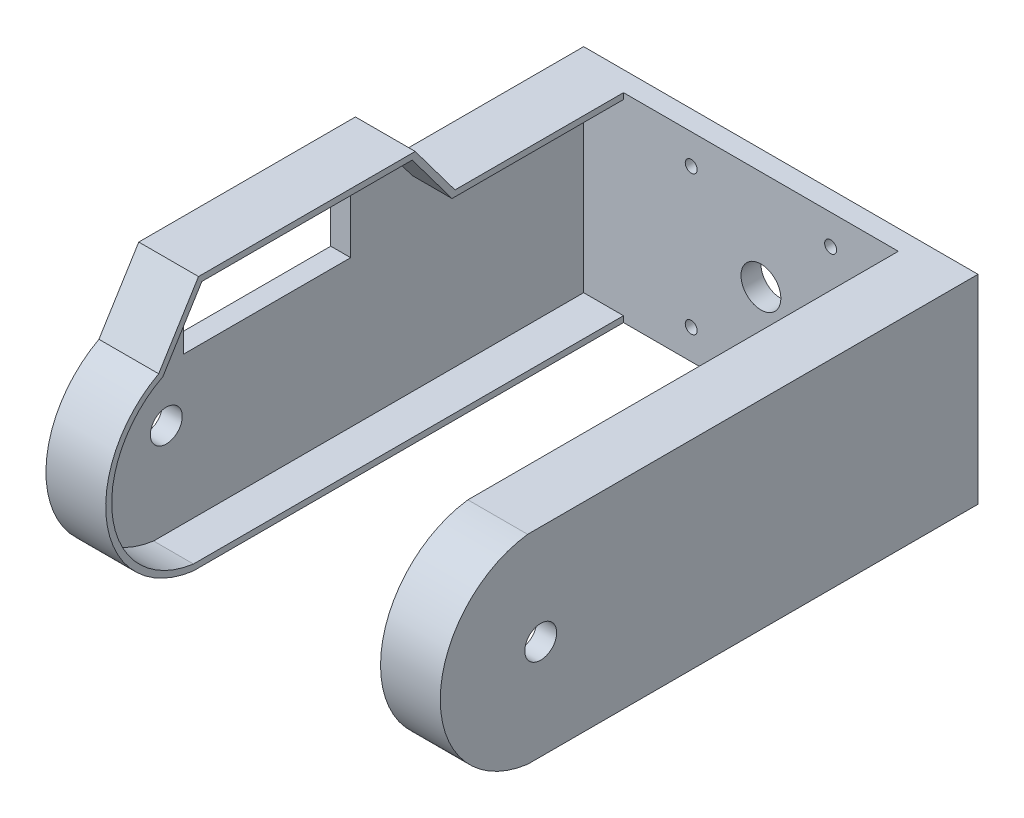
ISO-10303-21;
HEADER;
FILE_DESCRIPTION(('STEP AP214'),'2;1');
FILE_NAME('part.step','',(''),(''),'','','');
FILE_SCHEMA(('AUTOMOTIVE_DESIGN { 1 0 10303 214 1 1 1 1 }'));
ENDSEC;
DATA;
#1=APPLICATION_CONTEXT('core data for automotive mechanical design processes');
#2=APPLICATION_PROTOCOL_DEFINITION('international standard','automotive_design',2000,#1);
#3=PRODUCT_CONTEXT('',#1,'mechanical');
#4=PRODUCT('Part','Part','',(#3));
#5=PRODUCT_RELATED_PRODUCT_CATEGORY('part','',(#4));
#6=PRODUCT_DEFINITION_FORMATION('','',#4);
#7=PRODUCT_DEFINITION_CONTEXT('part definition',#1,'design');
#8=PRODUCT_DEFINITION('design','',#6,#7);
#9=PRODUCT_DEFINITION_SHAPE('','',#8);
#10=(LENGTH_UNIT() NAMED_UNIT(*) SI_UNIT(.MILLI.,.METRE.));
#11=(NAMED_UNIT(*) PLANE_ANGLE_UNIT() SI_UNIT($,.RADIAN.));
#12=(NAMED_UNIT(*) SI_UNIT($,.STERADIAN.) SOLID_ANGLE_UNIT());
#13=UNCERTAINTY_MEASURE_WITH_UNIT(LENGTH_MEASURE(1.E-05),#10,'distance_accuracy_value','');
#14=(GEOMETRIC_REPRESENTATION_CONTEXT(3) GLOBAL_UNCERTAINTY_ASSIGNED_CONTEXT((#13)) GLOBAL_UNIT_ASSIGNED_CONTEXT((#10,
#11,#12)) REPRESENTATION_CONTEXT('',''));
#15=CARTESIAN_POINT('',(0.,0.,0.));
#16=DIRECTION('',(0.,0.,1.));
#17=DIRECTION('',(1.,0.,0.));
#18=AXIS2_PLACEMENT_3D('',#15,#16,#17);
#19=CARTESIAN_POINT('',(0.,0.,5.));
#20=DIRECTION('',(0.,0.,1.));
#21=DIRECTION('',(1.,0.,0.));
#22=AXIS2_PLACEMENT_3D('',#19,#20,#21);
#23=PLANE('',#22);
#24=CARTESIAN_POINT('',(17.5,17.5,5.));
#25=DIRECTION('',(0.,0.,1.));
#26=DIRECTION('',(1.,0.,0.));
#27=AXIS2_PLACEMENT_3D('',#24,#25,#26);
#28=CIRCLE('',#27,1.5);
#29=CARTESIAN_POINT('',(19.,17.5,5.));
#30=VERTEX_POINT('',#29);
#31=EDGE_CURVE('E877',#30,#30,#28,.T.);
#32=ORIENTED_EDGE('',*,*,#31,.F.);
#33=EDGE_LOOP('',(#32));
#34=FACE_BOUND('',#33,.T.);
#35=CARTESIAN_POINT('',(17.5,-17.5,5.));
#36=DIRECTION('',(0.,0.,1.));
#37=DIRECTION('',(1.,0.,0.));
#38=AXIS2_PLACEMENT_3D('',#35,#36,#37);
#39=CIRCLE('',#38,1.5);
#40=CARTESIAN_POINT('',(19.,-17.5,5.));
#41=VERTEX_POINT('',#40);
#42=EDGE_CURVE('E897',#41,#41,#39,.T.);
#43=ORIENTED_EDGE('',*,*,#42,.F.);
#44=EDGE_LOOP('',(#43));
#45=FACE_BOUND('',#44,.T.);
#46=CARTESIAN_POINT('',(-17.5,-17.5,5.));
#47=DIRECTION('',(0.,0.,1.));
#48=DIRECTION('',(1.,0.,0.));
#49=AXIS2_PLACEMENT_3D('',#46,#47,#48);
#50=CIRCLE('',#49,1.5);
#51=CARTESIAN_POINT('',(-16.,-17.5,5.));
#52=VERTEX_POINT('',#51);
#53=EDGE_CURVE('E894',#52,#52,#50,.T.);
#54=ORIENTED_EDGE('',*,*,#53,.F.);
#55=EDGE_LOOP('',(#54));
#56=FACE_BOUND('',#55,.T.);
#57=CARTESIAN_POINT('',(-17.5,17.5,5.));
#58=DIRECTION('',(0.,0.,1.));
#59=DIRECTION('',(1.,0.,0.));
#60=AXIS2_PLACEMENT_3D('',#57,#58,#59);
#61=CIRCLE('',#60,1.5);
#62=CARTESIAN_POINT('',(-16.,17.5,5.));
#63=VERTEX_POINT('',#62);
#64=EDGE_CURVE('E891',#63,#63,#61,.T.);
#65=ORIENTED_EDGE('',*,*,#64,.F.);
#66=EDGE_LOOP('',(#65));
#67=FACE_BOUND('',#66,.T.);
#68=CARTESIAN_POINT('',(0.,0.,5.));
#69=DIRECTION('',(0.,0.,1.));
#70=DIRECTION('',(1.,0.,0.));
#71=AXIS2_PLACEMENT_3D('',#68,#69,#70);
#72=CIRCLE('',#71,5.);
#73=CARTESIAN_POINT('',(5.,0.,5.));
#74=VERTEX_POINT('',#73);
#75=EDGE_CURVE('E308',#74,#74,#72,.F.);
#76=ORIENTED_EDGE('',*,*,#75,.T.);
#77=EDGE_LOOP('',(#76));
#78=FACE_BOUND('',#77,.T.);
#79=DIRECTION('',(1.,0.,0.));
#80=VECTOR('',#79,1.);
#81=CARTESIAN_POINT('',(0.,-23.5,5.));
#82=LINE('',#81,#80);
#83=CARTESIAN_POINT('',(-44.5,-23.5,5.));
#84=VERTEX_POINT('',#83);
#85=CARTESIAN_POINT('',(-34.5,-23.5,5.));
#86=VERTEX_POINT('',#85);
#87=EDGE_CURVE('E121',#84,#86,#82,.T.);
#88=ORIENTED_EDGE('',*,*,#87,.T.);
#89=DIRECTION('',(0.,-1.,0.));
#90=VECTOR('',#89,1.);
#91=CARTESIAN_POINT('',(-34.5,0.,5.));
#92=LINE('',#91,#90);
#93=CARTESIAN_POINT('',(-34.5,-25.,5.));
#94=VERTEX_POINT('',#93);
#95=EDGE_CURVE('E345',#86,#94,#92,.T.);
#96=ORIENTED_EDGE('',*,*,#95,.T.);
#97=DIRECTION('',(1.,0.,0.));
#98=VECTOR('',#97,1.);
#99=CARTESIAN_POINT('',(-49.5,-25.,5.));
#100=LINE('',#99,#98);
#101=CARTESIAN_POINT('',(34.5,-25.,5.));
#102=VERTEX_POINT('',#101);
#103=EDGE_CURVE('E456',#94,#102,#100,.T.);
#104=ORIENTED_EDGE('',*,*,#103,.T.);
#105=DIRECTION('',(0.,1.,0.));
#106=VECTOR('',#105,1.);
#107=CARTESIAN_POINT('',(34.5,0.,5.));
#108=LINE('',#107,#106);
#109=CARTESIAN_POINT('',(34.5,-23.5,5.));
#110=VERTEX_POINT('',#109);
#111=EDGE_CURVE('E425',#102,#110,#108,.T.);
#112=ORIENTED_EDGE('',*,*,#111,.T.);
#113=DIRECTION('',(1.,0.,0.));
#114=VECTOR('',#113,1.);
#115=CARTESIAN_POINT('',(0.,-23.5,5.));
#116=LINE('',#115,#114);
#117=CARTESIAN_POINT('',(44.5,-23.5,5.));
#118=VERTEX_POINT('',#117);
#119=EDGE_CURVE('E479',#110,#118,#116,.T.);
#120=ORIENTED_EDGE('',*,*,#119,.T.);
#121=DIRECTION('',(0.,-1.,0.));
#122=VECTOR('',#121,1.);
#123=CARTESIAN_POINT('',(44.5,25.,5.));
#124=LINE('',#123,#122);
#125=CARTESIAN_POINT('',(44.5,23.5,5.));
#126=VERTEX_POINT('',#125);
#127=EDGE_CURVE('E452',#126,#118,#124,.T.);
#128=ORIENTED_EDGE('',*,*,#127,.F.);
#129=DIRECTION('',(-1.,0.,0.));
#130=VECTOR('',#129,1.);
#131=CARTESIAN_POINT('',(0.,23.5,5.));
#132=LINE('',#131,#130);
#133=CARTESIAN_POINT('',(34.5,23.5,5.));
#134=VERTEX_POINT('',#133);
#135=EDGE_CURVE('E484',#126,#134,#132,.T.);
#136=ORIENTED_EDGE('',*,*,#135,.T.);
#137=CARTESIAN_POINT('',(34.5,25.,5.));
#138=VERTEX_POINT('',#137);
#139=EDGE_CURVE('E422',#134,#138,#108,.T.);
#140=ORIENTED_EDGE('',*,*,#139,.T.);
#141=DIRECTION('',(-1.,0.,0.));
#142=VECTOR('',#141,1.);
#143=CARTESIAN_POINT('',(-49.5,25.,5.));
#144=LINE('',#143,#142);
#145=CARTESIAN_POINT('',(-34.5,25.,5.));
#146=VERTEX_POINT('',#145);
#147=EDGE_CURVE('E458',#138,#146,#144,.T.);
#148=ORIENTED_EDGE('',*,*,#147,.T.);
#149=CARTESIAN_POINT('',(-34.5,23.5,5.));
#150=VERTEX_POINT('',#149);
#151=EDGE_CURVE('E128',#146,#150,#92,.T.);
#152=ORIENTED_EDGE('',*,*,#151,.T.);
#153=DIRECTION('',(-1.,0.,0.));
#154=VECTOR('',#153,1.);
#155=CARTESIAN_POINT('',(0.,23.5,5.));
#156=LINE('',#155,#154);
#157=CARTESIAN_POINT('',(-44.5,23.5,5.));
#158=VERTEX_POINT('',#157);
#159=EDGE_CURVE('E347',#150,#158,#156,.T.);
#160=ORIENTED_EDGE('',*,*,#159,.T.);
#161=DIRECTION('',(0.,1.,0.));
#162=VECTOR('',#161,1.);
#163=CARTESIAN_POINT('',(-44.5,25.,5.));
#164=LINE('',#163,#162);
#165=EDGE_CURVE('E449',#84,#158,#164,.T.);
#166=ORIENTED_EDGE('',*,*,#165,.F.);
#167=EDGE_LOOP('',(#88,#96,#104,#112,#120,#128,#136,#140,#148,#152,#160,#166));
#168=FACE_BOUND('',#167,.T.);
#169=ADVANCED_FACE('F106',(#34,#45,#56,#67,#78,#168),#23,.T.);
#170=CARTESIAN_POINT('',(-44.5,25.,135.));
#171=DIRECTION('',(-1.,0.,0.));
#172=DIRECTION('',(0.,-1.,0.));
#173=AXIS2_PLACEMENT_3D('',#170,#171,#172);
#174=PLANE('',#173);
#175=CARTESIAN_POINT('',(-44.5,0.,109.785087719298));
#176=DIRECTION('',(-1.,0.,0.));
#177=DIRECTION('',(0.,-1.,0.));
#178=AXIS2_PLACEMENT_3D('',#175,#176,#177);
#179=CIRCLE('',#178,4.00000000000001);
#180=CARTESIAN_POINT('',(-44.5,-4.00000000000003,109.785087719298));
#181=VERTEX_POINT('',#180);
#182=EDGE_CURVE('E443',#181,#181,#179,.T.);
#183=ORIENTED_EDGE('',*,*,#182,.T.);
#184=EDGE_LOOP('',(#183));
#185=FACE_BOUND('',#184,.T.);
#186=DIRECTION('',(0.,0.,-1.));
#187=VECTOR('',#186,1.);
#188=CARTESIAN_POINT('',(-44.5,13.3649580572727,63.));
#189=LINE('',#188,#187);
#190=CARTESIAN_POINT('',(-44.5,13.3649580572727,105.455183238731));
#191=VERTEX_POINT('',#190);
#192=CARTESIAN_POINT('',(-44.5,13.3649580572727,63.5));
#193=VERTEX_POINT('',#192);
#194=EDGE_CURVE('E397',#191,#193,#189,.T.);
#195=ORIENTED_EDGE('',*,*,#194,.F.);
#196=DIRECTION('',(0.,-1.,0.));
#197=VECTOR('',#196,1.);
#198=CARTESIAN_POINT('',(-44.5,0.,105.455183238731));
#199=LINE('',#198,#197);
#200=CARTESIAN_POINT('',(-44.5,35.320141296004,105.455183238731));
#201=VERTEX_POINT('',#200);
#202=EDGE_CURVE('E358',#201,#191,#199,.T.);
#203=ORIENTED_EDGE('',*,*,#202,.F.);
#204=DIRECTION('',(0.,0.,1.));
#205=VECTOR('',#204,1.);
#206=CARTESIAN_POINT('',(-44.5,35.320141296004,0.));
#207=LINE('',#206,#205);
#208=CARTESIAN_POINT('',(-44.5,35.320141296004,63.5));
#209=VERTEX_POINT('',#208);
#210=EDGE_CURVE('E354',#209,#201,#207,.T.);
#211=ORIENTED_EDGE('',*,*,#210,.F.);
#212=DIRECTION('',(0.,-1.,0.));
#213=VECTOR('',#212,1.);
#214=CARTESIAN_POINT('',(-44.5,0.,63.5));
#215=LINE('',#214,#213);
#216=EDGE_CURVE('E351',#209,#193,#215,.T.);
#217=ORIENTED_EDGE('',*,*,#216,.T.);
#218=EDGE_LOOP('',(#195,#203,#211,#217));
#219=FACE_BOUND('',#218,.T.);
#220=DIRECTION('',(0.,0.,1.));
#221=VECTOR('',#220,1.);
#222=CARTESIAN_POINT('',(-44.5,-23.5,135.));
#223=LINE('',#222,#221);
#224=CARTESIAN_POINT('',(-44.5,-23.5,112.970533446568));
#225=VERTEX_POINT('',#224);
#226=EDGE_CURVE('E13',#84,#225,#223,.T.);
#227=ORIENTED_EDGE('',*,*,#226,.F.);
#228=ORIENTED_EDGE('',*,*,#165,.T.);
#229=DIRECTION('',(0.,0.,-1.));
#230=VECTOR('',#229,1.);
#231=CARTESIAN_POINT('',(-44.5,23.5,135.));
#232=LINE('',#231,#230);
#233=CARTESIAN_POINT('',(-44.5,23.5,48.0510660192979));
#234=VERTEX_POINT('',#233);
#235=EDGE_CURVE('E491',#234,#158,#232,.T.);
#236=ORIENTED_EDGE('',*,*,#235,.F.);
#237=DIRECTION('',(0.,-0.800681541347479,-0.599090201343192));
#238=VECTOR('',#237,1.);
#239=CARTESIAN_POINT('',(-44.5,66.1693415501921,79.9773476936151));
#240=LINE('',#239,#238);
#241=CARTESIAN_POINT('',(-44.5,36.8649580572726,58.0510660192979));
#242=VERTEX_POINT('',#241);
#243=EDGE_CURVE('E489',#242,#234,#240,.T.);
#244=ORIENTED_EDGE('',*,*,#243,.F.);
#245=DIRECTION('',(0.,0.,-1.));
#246=VECTOR('',#245,1.);
#247=CARTESIAN_POINT('',(-44.5,36.8649580572727,135.));
#248=LINE('',#247,#246);
#249=CARTESIAN_POINT('',(-44.5,36.8649580572727,110.864718169564));
#250=VERTEX_POINT('',#249);
#251=EDGE_CURVE('E287',#250,#242,#248,.T.);
#252=ORIENTED_EDGE('',*,*,#251,.F.);
#253=DIRECTION('',(0.,0.850103170583637,-0.52661617841047));
#254=VECTOR('',#253,1.);
#255=CARTESIAN_POINT('',(-44.5,17.4856080384555,122.869707211049));
#256=LINE('',#255,#254);
#257=CARTESIAN_POINT('',(-44.5,21.0846918512723,120.640171045476));
#258=VERTEX_POINT('',#257);
#259=EDGE_CURVE('E495',#258,#250,#256,.T.);
#260=ORIENTED_EDGE('',*,*,#259,.F.);
#261=CARTESIAN_POINT('',(-44.5,0.,109.785087719298));
#262=DIRECTION('',(-1.,0.,0.));
#263=DIRECTION('',(0.,-1.,0.));
#264=AXIS2_PLACEMENT_3D('',#261,#262,#263);
#265=CIRCLE('',#264,23.7149122807018);
#266=EDGE_CURVE('E114',#225,#258,#265,.T.);
#267=ORIENTED_EDGE('',*,*,#266,.F.);
#268=EDGE_LOOP('',(#227,#228,#236,#244,#252,#260,#267));
#269=FACE_BOUND('',#268,.T.);
#270=ADVANCED_FACE('F509',(#185,#219,#269),#174,.F.);
#271=CARTESIAN_POINT('',(-49.5,0.,109.785087719298));
#272=DIRECTION('',(1.,0.,0.));
#273=DIRECTION('',(0.,0.,-1.));
#274=AXIS2_PLACEMENT_3D('',#271,#272,#273);
#275=CYLINDRICAL_SURFACE('',#274,25.2149122807018);
#276=DIRECTION('',(1.,0.,0.));
#277=VECTOR('',#276,1.);
#278=CARTESIAN_POINT('',(-49.5,-25.,113.070175438597));
#279=LINE('',#278,#277);
#280=CARTESIAN_POINT('',(-49.5,-25.,113.070175438597));
#281=VERTEX_POINT('',#280);
#282=CARTESIAN_POINT('',(-34.5,-25.,113.070175438597));
#283=VERTEX_POINT('',#282);
#284=EDGE_CURVE('E438',#281,#283,#279,.T.);
#285=ORIENTED_EDGE('',*,*,#284,.T.);
#286=CARTESIAN_POINT('',(-34.5,0.,109.785087719298));
#287=DIRECTION('',(-1.,0.,0.));
#288=DIRECTION('',(0.,-1.,0.));
#289=AXIS2_PLACEMENT_3D('',#286,#287,#288);
#290=CIRCLE('',#289,25.2149122807018);
#291=CARTESIAN_POINT('',(-34.5,22.2222111111083,121.7));
#292=VERTEX_POINT('',#291);
#293=EDGE_CURVE('E339',#283,#292,#290,.T.);
#294=ORIENTED_EDGE('',*,*,#293,.T.);
#295=DIRECTION('',(-1.,0.,0.));
#296=VECTOR('',#295,1.);
#297=CARTESIAN_POINT('',(-44.5,22.2222111111083,121.7));
#298=LINE('',#297,#296);
#299=CARTESIAN_POINT('',(-49.5,22.2222111111083,121.7));
#300=VERTEX_POINT('',#299);
#301=EDGE_CURVE('E388',#292,#300,#298,.T.);
#302=ORIENTED_EDGE('',*,*,#301,.T.);
#303=CARTESIAN_POINT('',(-49.5,0.,109.785087719298));
#304=DIRECTION('',(1.,0.,0.));
#305=DIRECTION('',(0.,0.,-1.));
#306=AXIS2_PLACEMENT_3D('',#303,#304,#305);
#307=CIRCLE('',#306,25.2149122807018);
#308=EDGE_CURVE('E431',#300,#281,#307,.T.);
#309=ORIENTED_EDGE('',*,*,#308,.T.);
#310=EDGE_LOOP('',(#285,#294,#302,#309));
#311=FACE_BOUND('',#310,.T.);
#312=ADVANCED_FACE('F534',(#311),#275,.T.);
#313=CARTESIAN_POINT('',(49.501,13.3649580572727,63.));
#314=DIRECTION('',(0.,-1.,0.));
#315=DIRECTION('',(1.,0.,0.));
#316=AXIS2_PLACEMENT_3D('',#313,#314,#315);
#317=PLANE('',#316);
#318=DIRECTION('',(-1.,0.,0.));
#319=VECTOR('',#318,1.);
#320=CARTESIAN_POINT('',(-44.5,13.3649580572727,63.5));
#321=LINE('',#320,#319);
#322=CARTESIAN_POINT('',(-49.5,13.3649580572727,63.5));
#323=VERTEX_POINT('',#322);
#324=EDGE_CURVE('E377',#193,#323,#321,.T.);
#325=ORIENTED_EDGE('',*,*,#324,.T.);
#326=DIRECTION('',(0.,0.,1.));
#327=VECTOR('',#326,1.);
#328=CARTESIAN_POINT('',(-49.5,13.3649580572727,63.));
#329=LINE('',#328,#327);
#330=CARTESIAN_POINT('',(-49.5,13.3649580572727,105.455183238731));
#331=VERTEX_POINT('',#330);
#332=EDGE_CURVE('E379',#323,#331,#329,.T.);
#333=ORIENTED_EDGE('',*,*,#332,.T.);
#334=DIRECTION('',(-1.,0.,0.));
#335=VECTOR('',#334,1.);
#336=CARTESIAN_POINT('',(-44.5,13.3649580572727,105.455183238731));
#337=LINE('',#336,#335);
#338=EDGE_CURVE('E390',#191,#331,#337,.T.);
#339=ORIENTED_EDGE('',*,*,#338,.F.);
#340=ORIENTED_EDGE('',*,*,#194,.T.);
#341=EDGE_LOOP('',(#325,#333,#339,#340));
#342=FACE_BOUND('',#341,.T.);
#343=ADVANCED_FACE('F663',(#342),#317,.F.);
#344=CARTESIAN_POINT('',(44.5,25.,135.));
#345=DIRECTION('',(1.,0.,0.));
#346=DIRECTION('',(0.,0.,-1.));
#347=AXIS2_PLACEMENT_3D('',#344,#345,#346);
#348=PLANE('',#347);
#349=CARTESIAN_POINT('',(44.5,0.,109.785087719298));
#350=DIRECTION('',(1.,0.,0.));
#351=DIRECTION('',(0.,0.,-1.));
#352=AXIS2_PLACEMENT_3D('',#349,#350,#351);
#353=CIRCLE('',#352,4.00000000000001);
#354=CARTESIAN_POINT('',(44.5,0.,105.785087719298));
#355=VERTEX_POINT('',#354);
#356=EDGE_CURVE('E446',#355,#355,#353,.T.);
#357=ORIENTED_EDGE('',*,*,#356,.T.);
#358=EDGE_LOOP('',(#357));
#359=FACE_BOUND('',#358,.T.);
#360=DIRECTION('',(0.,0.,1.));
#361=VECTOR('',#360,1.);
#362=CARTESIAN_POINT('',(44.5,23.5,135.));
#363=LINE('',#362,#361);
#364=CARTESIAN_POINT('',(44.5,23.5,112.970533446568));
#365=VERTEX_POINT('',#364);
#366=EDGE_CURVE('E428',#126,#365,#363,.T.);
#367=ORIENTED_EDGE('',*,*,#366,.F.);
#368=ORIENTED_EDGE('',*,*,#127,.T.);
#369=DIRECTION('',(0.,0.,-1.));
#370=VECTOR('',#369,1.);
#371=CARTESIAN_POINT('',(44.5,-23.5,135.));
#372=LINE('',#371,#370);
#373=CARTESIAN_POINT('',(44.5,-23.5,112.970533446568));
#374=VERTEX_POINT('',#373);
#375=EDGE_CURVE('E426',#374,#118,#372,.T.);
#376=ORIENTED_EDGE('',*,*,#375,.F.);
#377=CARTESIAN_POINT('',(44.5,0.,109.785087719298));
#378=DIRECTION('',(1.,0.,0.));
#379=DIRECTION('',(0.,0.,-1.));
#380=AXIS2_PLACEMENT_3D('',#377,#378,#379);
#381=CIRCLE('',#380,23.7149122807018);
#382=EDGE_CURVE('E487',#365,#374,#381,.T.);
#383=ORIENTED_EDGE('',*,*,#382,.F.);
#384=EDGE_LOOP('',(#367,#368,#376,#383));
#385=FACE_BOUND('',#384,.T.);
#386=ADVANCED_FACE('F554',(#359,#385),#348,.F.);
#387=CARTESIAN_POINT('',(-49.5,25.,5.));
#388=DIRECTION('',(1.,0.,0.));
#389=DIRECTION('',(0.,1.,0.));
#390=AXIS2_PLACEMENT_3D('',#387,#388,#389);
#391=PLANE('',#390);
#392=DIRECTION('',(0.,-0.800681541347479,-0.599090201343192));
#393=VECTOR('',#392,1.);
#394=CARTESIAN_POINT('',(-49.5,-13.7161592995386,18.3315893745204));
#395=LINE('',#394,#393);
#396=CARTESIAN_POINT('',(-49.5,38.3649580572727,57.3));
#397=VERTEX_POINT('',#396);
#398=CARTESIAN_POINT('',(-49.5,25.,47.3));
#399=VERTEX_POINT('',#398);
#400=EDGE_CURVE('E355',#397,#399,#395,.T.);
#401=ORIENTED_EDGE('',*,*,#400,.T.);
#402=DIRECTION('',(0.,0.,-1.));
#403=VECTOR('',#402,1.);
#404=CARTESIAN_POINT('',(-49.5,25.,5.));
#405=LINE('',#404,#403);
#406=CARTESIAN_POINT('',(-49.5,25.,0.));
#407=VERTEX_POINT('',#406);
#408=EDGE_CURVE('E461',#399,#407,#405,.T.);
#409=ORIENTED_EDGE('',*,*,#408,.T.);
#410=DIRECTION('',(0.,-1.,0.));
#411=VECTOR('',#410,1.);
#412=CARTESIAN_POINT('',(-49.5,25.,0.));
#413=LINE('',#412,#411);
#414=CARTESIAN_POINT('',(-49.5,-25.,0.));
#415=VERTEX_POINT('',#414);
#416=EDGE_CURVE('E455',#407,#415,#413,.T.);
#417=ORIENTED_EDGE('',*,*,#416,.T.);
#418=DIRECTION('',(0.,0.,-1.));
#419=VECTOR('',#418,1.);
#420=CARTESIAN_POINT('',(-49.5,-25.,5.));
#421=LINE('',#420,#419);
#422=EDGE_CURVE('E477',#281,#415,#421,.T.);
#423=ORIENTED_EDGE('',*,*,#422,.F.);
#424=ORIENTED_EDGE('',*,*,#308,.F.);
#425=DIRECTION('',(0.,-0.850103170583637,0.52661617841047));
#426=VECTOR('',#425,1.);
#427=CARTESIAN_POINT('',(-49.5,60.6451884880585,97.8979931265169));
#428=LINE('',#427,#426);
#429=CARTESIAN_POINT('',(-49.5,38.3649580572727,111.7));
#430=VERTEX_POINT('',#429);
#431=EDGE_CURVE('E370',#430,#300,#428,.T.);
#432=ORIENTED_EDGE('',*,*,#431,.F.);
#433=DIRECTION('',(0.,0.,1.));
#434=VECTOR('',#433,1.);
#435=CARTESIAN_POINT('',(-49.5,38.3649580572727,0.));
#436=LINE('',#435,#434);
#437=EDGE_CURVE('E373',#397,#430,#436,.T.);
#438=ORIENTED_EDGE('',*,*,#437,.F.);
#439=EDGE_LOOP('',(#401,#409,#417,#423,#424,#432,#438));
#440=FACE_BOUND('',#439,.T.);
#441=CARTESIAN_POINT('',(-49.5,0.,109.785087719298));
#442=DIRECTION('',(1.,0.,0.));
#443=DIRECTION('',(0.,0.,-1.));
#444=AXIS2_PLACEMENT_3D('',#441,#442,#443);
#445=CIRCLE('',#444,4.00000000000001);
#446=CARTESIAN_POINT('',(-49.5,0.,105.785087719298));
#447=VERTEX_POINT('',#446);
#448=EDGE_CURVE('E435',#447,#447,#445,.T.);
#449=ORIENTED_EDGE('',*,*,#448,.T.);
#450=EDGE_LOOP('',(#449));
#451=FACE_BOUND('',#450,.T.);
#452=DIRECTION('',(0.,-1.,0.));
#453=VECTOR('',#452,1.);
#454=CARTESIAN_POINT('',(-49.5,0.,105.455183238731));
#455=LINE('',#454,#453);
#456=CARTESIAN_POINT('',(-49.5,35.320141296004,105.455183238731));
#457=VERTEX_POINT('',#456);
#458=EDGE_CURVE('E367',#457,#331,#455,.T.);
#459=ORIENTED_EDGE('',*,*,#458,.T.);
#460=ORIENTED_EDGE('',*,*,#332,.F.);
#461=DIRECTION('',(0.,-1.,0.));
#462=VECTOR('',#461,1.);
#463=CARTESIAN_POINT('',(-49.5,0.,63.5));
#464=LINE('',#463,#462);
#465=CARTESIAN_POINT('',(-49.5,35.320141296004,63.5));
#466=VERTEX_POINT('',#465);
#467=EDGE_CURVE('E350',#466,#323,#464,.T.);
#468=ORIENTED_EDGE('',*,*,#467,.F.);
#469=DIRECTION('',(0.,0.,1.));
#470=VECTOR('',#469,1.);
#471=CARTESIAN_POINT('',(-49.5,35.320141296004,0.));
#472=LINE('',#471,#470);
#473=EDGE_CURVE('E364',#466,#457,#472,.T.);
#474=ORIENTED_EDGE('',*,*,#473,.T.);
#475=EDGE_LOOP('',(#459,#460,#468,#474));
#476=FACE_BOUND('',#475,.T.);
#477=ADVANCED_FACE('F108',(#440,#451,#476),#391,.F.);
#478=CARTESIAN_POINT('',(49.5,25.,5.));
#479=DIRECTION('',(-1.,0.,0.));
#480=DIRECTION('',(0.,-1.,0.));
#481=AXIS2_PLACEMENT_3D('',#478,#479,#480);
#482=PLANE('',#481);
#483=CARTESIAN_POINT('',(49.5,0.,109.785087719298));
#484=DIRECTION('',(1.,0.,0.));
#485=DIRECTION('',(0.,0.,-1.));
#486=AXIS2_PLACEMENT_3D('',#483,#484,#485);
#487=CIRCLE('',#486,25.2149122807018);
#488=CARTESIAN_POINT('',(49.5,25.,113.070175438596));
#489=VERTEX_POINT('',#488);
#490=CARTESIAN_POINT('',(49.5,-25.,113.070175438597));
#491=VERTEX_POINT('',#490);
#492=EDGE_CURVE('E430',#489,#491,#487,.T.);
#493=ORIENTED_EDGE('',*,*,#492,.T.);
#494=DIRECTION('',(0.,0.,-1.));
#495=VECTOR('',#494,1.);
#496=CARTESIAN_POINT('',(49.5,-25.,5.));
#497=LINE('',#496,#495);
#498=CARTESIAN_POINT('',(49.5,-25.,0.));
#499=VERTEX_POINT('',#498);
#500=EDGE_CURVE('E474',#491,#499,#497,.T.);
#501=ORIENTED_EDGE('',*,*,#500,.T.);
#502=DIRECTION('',(0.,1.,0.));
#503=VECTOR('',#502,1.);
#504=CARTESIAN_POINT('',(49.5,25.,0.));
#505=LINE('',#504,#503);
#506=CARTESIAN_POINT('',(49.5,25.,0.));
#507=VERTEX_POINT('',#506);
#508=EDGE_CURVE('E466',#499,#507,#505,.T.);
#509=ORIENTED_EDGE('',*,*,#508,.T.);
#510=DIRECTION('',(0.,0.,-1.));
#511=VECTOR('',#510,1.);
#512=CARTESIAN_POINT('',(49.5,25.,5.));
#513=LINE('',#512,#511);
#514=EDGE_CURVE('E472',#489,#507,#513,.T.);
#515=ORIENTED_EDGE('',*,*,#514,.F.);
#516=EDGE_LOOP('',(#493,#501,#509,#515));
#517=FACE_BOUND('',#516,.T.);
#518=CARTESIAN_POINT('',(49.5,0.,109.785087719298));
#519=DIRECTION('',(1.,0.,0.));
#520=DIRECTION('',(0.,0.,-1.));
#521=AXIS2_PLACEMENT_3D('',#518,#519,#520);
#522=CIRCLE('',#521,4.00000000000001);
#523=CARTESIAN_POINT('',(49.5,0.,105.785087719298));
#524=VERTEX_POINT('',#523);
#525=EDGE_CURVE('E433',#524,#524,#522,.T.);
#526=ORIENTED_EDGE('',*,*,#525,.F.);
#527=EDGE_LOOP('',(#526));
#528=FACE_BOUND('',#527,.T.);
#529=ADVANCED_FACE('F594',(#517,#528),#482,.F.);
#530=CARTESIAN_POINT('',(-49.5,25.,5.));
#531=DIRECTION('',(0.,-1.,0.));
#532=DIRECTION('',(0.,0.,-1.));
#533=AXIS2_PLACEMENT_3D('',#530,#531,#532);
#534=PLANE('',#533);
#535=DIRECTION('',(0.,0.,-1.));
#536=VECTOR('',#535,1.);
#537=CARTESIAN_POINT('',(-34.5,25.,47.3));
#538=LINE('',#537,#536);
#539=CARTESIAN_POINT('',(-34.5,25.,47.3));
#540=VERTEX_POINT('',#539);
#541=EDGE_CURVE('E333',#540,#146,#538,.T.);
#542=ORIENTED_EDGE('',*,*,#541,.T.);
#543=ORIENTED_EDGE('',*,*,#147,.F.);
#544=DIRECTION('',(0.,0.,1.));
#545=VECTOR('',#544,1.);
#546=CARTESIAN_POINT('',(34.5,25.,0.));
#547=LINE('',#546,#545);
#548=CARTESIAN_POINT('',(34.5,25.,113.070175438596));
#549=VERTEX_POINT('',#548);
#550=EDGE_CURVE('E419',#138,#549,#547,.T.);
#551=ORIENTED_EDGE('',*,*,#550,.T.);
#552=DIRECTION('',(1.,0.,0.));
#553=VECTOR('',#552,1.);
#554=CARTESIAN_POINT('',(-49.5,25.,113.070175438596));
#555=LINE('',#554,#553);
#556=EDGE_CURVE('E441',#489,#549,#555,.F.);
#557=ORIENTED_EDGE('',*,*,#556,.F.);
#558=ORIENTED_EDGE('',*,*,#514,.T.);
#559=DIRECTION('',(-1.,0.,0.));
#560=VECTOR('',#559,1.);
#561=CARTESIAN_POINT('',(-49.5,25.,0.));
#562=LINE('',#561,#560);
#563=EDGE_CURVE('E459',#507,#407,#562,.T.);
#564=ORIENTED_EDGE('',*,*,#563,.T.);
#565=ORIENTED_EDGE('',*,*,#408,.F.);
#566=DIRECTION('',(-1.,0.,0.));
#567=VECTOR('',#566,1.);
#568=CARTESIAN_POINT('',(-44.5,25.,47.3));
#569=LINE('',#568,#567);
#570=EDGE_CURVE('E380',#540,#399,#569,.T.);
#571=ORIENTED_EDGE('',*,*,#570,.F.);
#572=EDGE_LOOP('',(#542,#543,#551,#557,#558,#564,#565,#571));
#573=FACE_BOUND('',#572,.T.);
#574=ADVANCED_FACE('F516',(#573),#534,.F.);
#575=CARTESIAN_POINT('',(-49.5,-25.,5.));
#576=DIRECTION('',(0.,1.,0.));
#577=DIRECTION('',(0.,0.,1.));
#578=AXIS2_PLACEMENT_3D('',#575,#576,#577);
#579=PLANE('',#578);
#580=ORIENTED_EDGE('',*,*,#103,.F.);
#581=DIRECTION('',(0.,0.,1.));
#582=VECTOR('',#581,1.);
#583=CARTESIAN_POINT('',(-34.5,-25.,0.));
#584=LINE('',#583,#582);
#585=EDGE_CURVE('E336',#94,#283,#584,.T.);
#586=ORIENTED_EDGE('',*,*,#585,.T.);
#587=ORIENTED_EDGE('',*,*,#284,.F.);
#588=ORIENTED_EDGE('',*,*,#422,.T.);
#589=DIRECTION('',(1.,0.,0.));
#590=VECTOR('',#589,1.);
#591=CARTESIAN_POINT('',(-49.5,-25.,0.));
#592=LINE('',#591,#590);
#593=EDGE_CURVE('E464',#415,#499,#592,.T.);
#594=ORIENTED_EDGE('',*,*,#593,.T.);
#595=ORIENTED_EDGE('',*,*,#500,.F.);
#596=CARTESIAN_POINT('',(34.5,-25.,113.070175438597));
#597=VERTEX_POINT('',#596);
#598=EDGE_CURVE('E444',#597,#491,#279,.T.);
#599=ORIENTED_EDGE('',*,*,#598,.F.);
#600=DIRECTION('',(0.,0.,-1.));
#601=VECTOR('',#600,1.);
#602=CARTESIAN_POINT('',(34.5,-25.,113.070175438597));
#603=LINE('',#602,#601);
#604=EDGE_CURVE('E416',#597,#102,#603,.T.);
#605=ORIENTED_EDGE('',*,*,#604,.T.);
#606=EDGE_LOOP('',(#580,#586,#587,#588,#594,#595,#599,#605));
#607=FACE_BOUND('',#606,.T.);
#608=ADVANCED_FACE('F539',(#607),#579,.F.);
#609=CARTESIAN_POINT('',(0.,0.,0.));
#610=DIRECTION('',(0.,0.,1.));
#611=DIRECTION('',(1.,0.,0.));
#612=AXIS2_PLACEMENT_3D('',#609,#610,#611);
#613=PLANE('',#612);
#614=CARTESIAN_POINT('',(17.5,17.5,0.));
#615=DIRECTION('',(0.,0.,-1.));
#616=DIRECTION('',(-1.,0.,0.));
#617=AXIS2_PLACEMENT_3D('',#614,#615,#616);
#618=CIRCLE('',#617,1.5);
#619=CARTESIAN_POINT('',(16.,17.5,0.));
#620=VERTEX_POINT('',#619);
#621=EDGE_CURVE('E880',#620,#620,#618,.T.);
#622=ORIENTED_EDGE('',*,*,#621,.F.);
#623=EDGE_LOOP('',(#622));
#624=FACE_BOUND('',#623,.T.);
#625=CARTESIAN_POINT('',(17.5,-17.5,0.));
#626=DIRECTION('',(0.,0.,-1.));
#627=DIRECTION('',(-1.,0.,0.));
#628=AXIS2_PLACEMENT_3D('',#625,#626,#627);
#629=CIRCLE('',#628,1.5);
#630=CARTESIAN_POINT('',(16.,-17.5,0.));
#631=VERTEX_POINT('',#630);
#632=EDGE_CURVE('E881',#631,#631,#629,.T.);
#633=ORIENTED_EDGE('',*,*,#632,.F.);
#634=EDGE_LOOP('',(#633));
#635=FACE_BOUND('',#634,.T.);
#636=CARTESIAN_POINT('',(-17.5,-17.5,0.));
#637=DIRECTION('',(0.,0.,-1.));
#638=DIRECTION('',(-1.,0.,0.));
#639=AXIS2_PLACEMENT_3D('',#636,#637,#638);
#640=CIRCLE('',#639,1.5);
#641=CARTESIAN_POINT('',(-19.,-17.5,0.));
#642=VERTEX_POINT('',#641);
#643=EDGE_CURVE('E884',#642,#642,#640,.T.);
#644=ORIENTED_EDGE('',*,*,#643,.F.);
#645=EDGE_LOOP('',(#644));
#646=FACE_BOUND('',#645,.T.);
#647=CARTESIAN_POINT('',(-17.5,17.5,0.));
#648=DIRECTION('',(0.,0.,-1.));
#649=DIRECTION('',(-1.,0.,0.));
#650=AXIS2_PLACEMENT_3D('',#647,#648,#649);
#651=CIRCLE('',#650,1.5);
#652=CARTESIAN_POINT('',(-19.,17.5,0.));
#653=VERTEX_POINT('',#652);
#654=EDGE_CURVE('E888',#653,#653,#651,.T.);
#655=ORIENTED_EDGE('',*,*,#654,.F.);
#656=EDGE_LOOP('',(#655));
#657=FACE_BOUND('',#656,.T.);
#658=CARTESIAN_POINT('',(0.,0.,0.));
#659=DIRECTION('',(0.,0.,-1.));
#660=DIRECTION('',(-1.,0.,0.));
#661=AXIS2_PLACEMENT_3D('',#658,#659,#660);
#662=CIRCLE('',#661,5.);
#663=CARTESIAN_POINT('',(-5.,0.,0.));
#664=VERTEX_POINT('',#663);
#665=EDGE_CURVE('E305',#664,#664,#662,.T.);
#666=ORIENTED_EDGE('',*,*,#665,.F.);
#667=EDGE_LOOP('',(#666));
#668=FACE_BOUND('',#667,.T.);
#669=ORIENTED_EDGE('',*,*,#416,.F.);
#670=ORIENTED_EDGE('',*,*,#563,.F.);
#671=ORIENTED_EDGE('',*,*,#508,.F.);
#672=ORIENTED_EDGE('',*,*,#593,.F.);
#673=EDGE_LOOP('',(#669,#670,#671,#672));
#674=FACE_BOUND('',#673,.T.);
#675=ADVANCED_FACE('F587',(#624,#635,#646,#657,#668,#674),#613,.F.);
#676=CARTESIAN_POINT('',(-49.5,0.,109.785087719298));
#677=DIRECTION('',(1.,0.,0.));
#678=DIRECTION('',(0.,0.,-1.));
#679=AXIS2_PLACEMENT_3D('',#676,#677,#678);
#680=CYLINDRICAL_SURFACE('',#679,4.00000000000001);
#681=ORIENTED_EDGE('',*,*,#448,.F.);
#682=EDGE_LOOP('',(#681));
#683=FACE_BOUND('',#682,.T.);
#684=ORIENTED_EDGE('',*,*,#182,.F.);
#685=EDGE_LOOP('',(#684));
#686=FACE_BOUND('',#685,.T.);
#687=ADVANCED_FACE('F590',(#683,#686),#680,.F.);
#688=ORIENTED_EDGE('',*,*,#525,.T.);
#689=EDGE_LOOP('',(#688));
#690=FACE_BOUND('',#689,.T.);
#691=ORIENTED_EDGE('',*,*,#356,.F.);
#692=EDGE_LOOP('',(#691));
#693=FACE_BOUND('',#692,.T.);
#694=ADVANCED_FACE('F570',(#690,#693),#680,.F.);
#695=ORIENTED_EDGE('',*,*,#556,.T.);
#696=CARTESIAN_POINT('',(34.5,0.,109.785087719298));
#697=DIRECTION('',(1.,0.,0.));
#698=DIRECTION('',(0.,1.,0.));
#699=AXIS2_PLACEMENT_3D('',#696,#697,#698);
#700=CIRCLE('',#699,25.2149122807018);
#701=EDGE_CURVE('E411',#549,#597,#700,.T.);
#702=ORIENTED_EDGE('',*,*,#701,.T.);
#703=ORIENTED_EDGE('',*,*,#598,.T.);
#704=ORIENTED_EDGE('',*,*,#492,.F.);
#705=EDGE_LOOP('',(#695,#702,#703,#704));
#706=FACE_BOUND('',#705,.T.);
#707=ADVANCED_FACE('F563',(#706),#275,.T.);
#708=CARTESIAN_POINT('',(34.5,0.,109.785087719298));
#709=DIRECTION('',(1.,0.,0.));
#710=DIRECTION('',(0.,1.,0.));
#711=AXIS2_PLACEMENT_3D('',#708,#709,#710);
#712=CYLINDRICAL_SURFACE('',#711,23.7149122807018);
#713=DIRECTION('',(1.,0.,0.));
#714=VECTOR('',#713,1.);
#715=CARTESIAN_POINT('',(34.5,23.5,112.970533446568));
#716=LINE('',#715,#714);
#717=CARTESIAN_POINT('',(34.5,23.5,112.970533446568));
#718=VERTEX_POINT('',#717);
#719=EDGE_CURVE('E408',#718,#365,#716,.T.);
#720=ORIENTED_EDGE('',*,*,#719,.T.);
#721=ORIENTED_EDGE('',*,*,#382,.T.);
#722=DIRECTION('',(1.,0.,0.));
#723=VECTOR('',#722,1.);
#724=CARTESIAN_POINT('',(34.5,-23.5,112.970533446568));
#725=LINE('',#724,#723);
#726=CARTESIAN_POINT('',(34.5,-23.5,112.970533446568));
#727=VERTEX_POINT('',#726);
#728=EDGE_CURVE('E407',#727,#374,#725,.T.);
#729=ORIENTED_EDGE('',*,*,#728,.F.);
#730=CARTESIAN_POINT('',(34.5,0.,109.785087719298));
#731=DIRECTION('',(1.,0.,0.));
#732=DIRECTION('',(0.,0.,-1.));
#733=AXIS2_PLACEMENT_3D('',#730,#731,#732);
#734=CIRCLE('',#733,23.7149122807018);
#735=EDGE_CURVE('E399',#718,#727,#734,.T.);
#736=ORIENTED_EDGE('',*,*,#735,.F.);
#737=EDGE_LOOP('',(#720,#721,#729,#736));
#738=FACE_BOUND('',#737,.T.);
#739=ADVANCED_FACE('F561',(#738),#712,.F.);
#740=CARTESIAN_POINT('',(34.5,23.5,0.));
#741=DIRECTION('',(0.,1.,0.));
#742=DIRECTION('',(-1.,0.,0.));
#743=AXIS2_PLACEMENT_3D('',#740,#741,#742);
#744=PLANE('',#743);
#745=ORIENTED_EDGE('',*,*,#135,.F.);
#746=ORIENTED_EDGE('',*,*,#366,.T.);
#747=ORIENTED_EDGE('',*,*,#719,.F.);
#748=DIRECTION('',(0.,0.,1.));
#749=VECTOR('',#748,1.);
#750=CARTESIAN_POINT('',(34.5,23.5,0.));
#751=LINE('',#750,#749);
#752=EDGE_CURVE('E405',#134,#718,#751,.T.);
#753=ORIENTED_EDGE('',*,*,#752,.F.);
#754=EDGE_LOOP('',(#745,#746,#747,#753));
#755=FACE_BOUND('',#754,.T.);
#756=ADVANCED_FACE('F558',(#755),#744,.F.);
#757=CARTESIAN_POINT('',(34.5,-23.5,113.070175438597));
#758=DIRECTION('',(0.,-1.,0.));
#759=DIRECTION('',(1.,0.,0.));
#760=AXIS2_PLACEMENT_3D('',#757,#758,#759);
#761=PLANE('',#760);
#762=ORIENTED_EDGE('',*,*,#728,.T.);
#763=ORIENTED_EDGE('',*,*,#375,.T.);
#764=ORIENTED_EDGE('',*,*,#119,.F.);
#765=DIRECTION('',(0.,0.,-1.));
#766=VECTOR('',#765,1.);
#767=CARTESIAN_POINT('',(34.5,-23.5,113.070175438597));
#768=LINE('',#767,#766);
#769=EDGE_CURVE('E402',#727,#110,#768,.T.);
#770=ORIENTED_EDGE('',*,*,#769,.F.);
#771=EDGE_LOOP('',(#762,#763,#764,#770));
#772=FACE_BOUND('',#771,.T.);
#773=ADVANCED_FACE('F549',(#772),#761,.F.);
#774=CARTESIAN_POINT('',(34.5,0.,109.785087719298));
#775=DIRECTION('',(1.,0.,0.));
#776=DIRECTION('',(0.,1.,0.));
#777=AXIS2_PLACEMENT_3D('',#774,#775,#776);
#778=PLANE('',#777);
#779=ORIENTED_EDGE('',*,*,#111,.F.);
#780=ORIENTED_EDGE('',*,*,#604,.F.);
#781=ORIENTED_EDGE('',*,*,#701,.F.);
#782=ORIENTED_EDGE('',*,*,#550,.F.);
#783=ORIENTED_EDGE('',*,*,#139,.F.);
#784=ORIENTED_EDGE('',*,*,#752,.T.);
#785=ORIENTED_EDGE('',*,*,#735,.T.);
#786=ORIENTED_EDGE('',*,*,#769,.T.);
#787=EDGE_LOOP('',(#779,#780,#781,#782,#783,#784,#785,#786));
#788=FACE_BOUND('',#787,.T.);
#789=ADVANCED_FACE('F544',(#788),#778,.F.);
#790=CARTESIAN_POINT('',(-44.5,0.,63.5));
#791=DIRECTION('',(0.,0.,-1.));
#792=DIRECTION('',(-1.,0.,0.));
#793=AXIS2_PLACEMENT_3D('',#790,#791,#792);
#794=PLANE('',#793);
#795=ORIENTED_EDGE('',*,*,#467,.T.);
#796=ORIENTED_EDGE('',*,*,#324,.F.);
#797=ORIENTED_EDGE('',*,*,#216,.F.);
#798=DIRECTION('',(-1.,0.,0.));
#799=VECTOR('',#798,1.);
#800=CARTESIAN_POINT('',(-44.5,35.320141296004,63.5));
#801=LINE('',#800,#799);
#802=EDGE_CURVE('E361',#209,#466,#801,.T.);
#803=ORIENTED_EDGE('',*,*,#802,.T.);
#804=EDGE_LOOP('',(#795,#796,#797,#803));
#805=FACE_BOUND('',#804,.T.);
#806=ADVANCED_FACE('F657',(#805),#794,.F.);
#807=CARTESIAN_POINT('',(-44.5,-13.7161592995386,18.3315893745204));
#808=DIRECTION('',(0.,0.599090201343192,-0.800681541347479));
#809=DIRECTION('',(0.,0.800681541347479,0.599090201343192));
#810=AXIS2_PLACEMENT_3D('',#807,#808,#809);
#811=PLANE('',#810);
#812=ORIENTED_EDGE('',*,*,#400,.F.);
#813=DIRECTION('',(-1.,0.,0.));
#814=VECTOR('',#813,1.);
#815=CARTESIAN_POINT('',(-44.5,38.3649580572727,57.3));
#816=LINE('',#815,#814);
#817=CARTESIAN_POINT('',(-34.5,38.3649580572727,57.3));
#818=VERTEX_POINT('',#817);
#819=EDGE_CURVE('E383',#818,#397,#816,.T.);
#820=ORIENTED_EDGE('',*,*,#819,.F.);
#821=DIRECTION('',(0.,-0.800681541347479,-0.599090201343192));
#822=VECTOR('',#821,1.);
#823=CARTESIAN_POINT('',(-34.5,38.3649580572727,57.3));
#824=LINE('',#823,#822);
#825=EDGE_CURVE('E330',#818,#540,#824,.T.);
#826=ORIENTED_EDGE('',*,*,#825,.T.);
#827=ORIENTED_EDGE('',*,*,#570,.T.);
#828=EDGE_LOOP('',(#812,#820,#826,#827));
#829=FACE_BOUND('',#828,.T.);
#830=ADVANCED_FACE('F519',(#829),#811,.T.);
#831=CARTESIAN_POINT('',(-44.5,38.3649580572727,0.));
#832=DIRECTION('',(0.,-1.,0.));
#833=DIRECTION('',(1.,0.,0.));
#834=AXIS2_PLACEMENT_3D('',#831,#832,#833);
#835=PLANE('',#834);
#836=ORIENTED_EDGE('',*,*,#437,.T.);
#837=DIRECTION('',(-1.,0.,0.));
#838=VECTOR('',#837,1.);
#839=CARTESIAN_POINT('',(-44.5,38.3649580572727,111.7));
#840=LINE('',#839,#838);
#841=CARTESIAN_POINT('',(-34.5,38.3649580572727,111.7));
#842=VERTEX_POINT('',#841);
#843=EDGE_CURVE('E385',#842,#430,#840,.T.);
#844=ORIENTED_EDGE('',*,*,#843,.F.);
#845=DIRECTION('',(0.,0.,-1.));
#846=VECTOR('',#845,1.);
#847=CARTESIAN_POINT('',(-34.5,38.3649580572727,111.7));
#848=LINE('',#847,#846);
#849=EDGE_CURVE('E320',#842,#818,#848,.T.);
#850=ORIENTED_EDGE('',*,*,#849,.T.);
#851=ORIENTED_EDGE('',*,*,#819,.T.);
#852=EDGE_LOOP('',(#836,#844,#850,#851));
#853=FACE_BOUND('',#852,.T.);
#854=ADVANCED_FACE('F527',(#853),#835,.F.);
#855=CARTESIAN_POINT('',(-44.5,60.6451884880585,97.8979931265169));
#856=DIRECTION('',(0.,-0.52661617841047,-0.850103170583637));
#857=DIRECTION('',(0.,0.850103170583637,-0.52661617841047));
#858=AXIS2_PLACEMENT_3D('',#855,#856,#857);
#859=PLANE('',#858);
#860=ORIENTED_EDGE('',*,*,#431,.T.);
#861=ORIENTED_EDGE('',*,*,#301,.F.);
#862=DIRECTION('',(0.,0.850103170583637,-0.52661617841047));
#863=VECTOR('',#862,1.);
#864=CARTESIAN_POINT('',(-34.5,22.2222111111083,121.7));
#865=LINE('',#864,#863);
#866=EDGE_CURVE('E342',#292,#842,#865,.T.);
#867=ORIENTED_EDGE('',*,*,#866,.T.);
#868=ORIENTED_EDGE('',*,*,#843,.T.);
#869=EDGE_LOOP('',(#860,#861,#867,#868));
#870=FACE_BOUND('',#869,.T.);
#871=ADVANCED_FACE('F530',(#870),#859,.F.);
#872=CARTESIAN_POINT('',(-44.5,0.,105.455183238731));
#873=DIRECTION('',(0.,0.,-1.));
#874=DIRECTION('',(-1.,0.,0.));
#875=AXIS2_PLACEMENT_3D('',#872,#873,#874);
#876=PLANE('',#875);
#877=ORIENTED_EDGE('',*,*,#458,.F.);
#878=DIRECTION('',(-1.,0.,0.));
#879=VECTOR('',#878,1.);
#880=CARTESIAN_POINT('',(-44.5,35.320141296004,105.455183238731));
#881=LINE('',#880,#879);
#882=EDGE_CURVE('E393',#201,#457,#881,.T.);
#883=ORIENTED_EDGE('',*,*,#882,.F.);
#884=ORIENTED_EDGE('',*,*,#202,.T.);
#885=ORIENTED_EDGE('',*,*,#338,.T.);
#886=EDGE_LOOP('',(#877,#883,#884,#885));
#887=FACE_BOUND('',#886,.T.);
#888=ADVANCED_FACE('F686',(#887),#876,.T.);
#889=CARTESIAN_POINT('',(-44.5,35.320141296004,0.));
#890=DIRECTION('',(0.,-1.,0.));
#891=DIRECTION('',(1.,0.,0.));
#892=AXIS2_PLACEMENT_3D('',#889,#890,#891);
#893=PLANE('',#892);
#894=ORIENTED_EDGE('',*,*,#473,.F.);
#895=ORIENTED_EDGE('',*,*,#802,.F.);
#896=ORIENTED_EDGE('',*,*,#210,.T.);
#897=ORIENTED_EDGE('',*,*,#882,.T.);
#898=EDGE_LOOP('',(#894,#895,#896,#897));
#899=FACE_BOUND('',#898,.T.);
#900=ADVANCED_FACE('F691',(#899),#893,.T.);
#901=CARTESIAN_POINT('',(-34.5,36.8649580572727,111.7));
#902=DIRECTION('',(0.,1.,0.));
#903=DIRECTION('',(-1.,0.,0.));
#904=AXIS2_PLACEMENT_3D('',#901,#902,#903);
#905=PLANE('',#904);
#906=DIRECTION('',(-1.,0.,0.));
#907=VECTOR('',#906,1.);
#908=CARTESIAN_POINT('',(-34.5,36.8649580572727,110.864718169564));
#909=LINE('',#908,#907);
#910=CARTESIAN_POINT('',(-34.5,36.8649580572727,110.864718169564));
#911=VERTEX_POINT('',#910);
#912=EDGE_CURVE('E318',#911,#250,#909,.T.);
#913=ORIENTED_EDGE('',*,*,#912,.T.);
#914=ORIENTED_EDGE('',*,*,#251,.T.);
#915=DIRECTION('',(-1.,0.,0.));
#916=VECTOR('',#915,1.);
#917=CARTESIAN_POINT('',(-34.5,36.8649580572726,58.0510660192979));
#918=LINE('',#917,#916);
#919=CARTESIAN_POINT('',(-34.5,36.8649580572726,58.0510660192979));
#920=VERTEX_POINT('',#919);
#921=EDGE_CURVE('E280',#920,#242,#918,.T.);
#922=ORIENTED_EDGE('',*,*,#921,.F.);
#923=DIRECTION('',(0.,0.,-1.));
#924=VECTOR('',#923,1.);
#925=CARTESIAN_POINT('',(-34.5,36.8649580572727,111.7));
#926=LINE('',#925,#924);
#927=EDGE_CURVE('E285',#911,#920,#926,.T.);
#928=ORIENTED_EDGE('',*,*,#927,.F.);
#929=EDGE_LOOP('',(#913,#914,#922,#928));
#930=FACE_BOUND('',#929,.T.);
#931=ADVANCED_FACE('F283',(#930),#905,.F.);
#932=CARTESIAN_POINT('',(-34.5,21.4322868434926,120.424845244125));
#933=DIRECTION('',(0.,0.52661617841047,0.850103170583637));
#934=DIRECTION('',(0.,-0.850103170583637,0.52661617841047));
#935=AXIS2_PLACEMENT_3D('',#932,#933,#934);
#936=PLANE('',#935);
#937=DIRECTION('',(-1.,0.,0.));
#938=VECTOR('',#937,1.);
#939=CARTESIAN_POINT('',(-34.5,21.0846918512723,120.640171045476));
#940=LINE('',#939,#938);
#941=CARTESIAN_POINT('',(-34.5,21.0846918512723,120.640171045476));
#942=VERTEX_POINT('',#941);
#943=EDGE_CURVE('E321',#942,#258,#940,.T.);
#944=ORIENTED_EDGE('',*,*,#943,.T.);
#945=ORIENTED_EDGE('',*,*,#259,.T.);
#946=ORIENTED_EDGE('',*,*,#912,.F.);
#947=DIRECTION('',(0.,0.850103170583637,-0.52661617841047));
#948=VECTOR('',#947,1.);
#949=CARTESIAN_POINT('',(-34.5,21.4322868434926,120.424845244125));
#950=LINE('',#949,#948);
#951=EDGE_CURVE('E291',#942,#911,#950,.T.);
#952=ORIENTED_EDGE('',*,*,#951,.F.);
#953=EDGE_LOOP('',(#944,#945,#946,#952));
#954=FACE_BOUND('',#953,.T.);
#955=ADVANCED_FACE('F504',(#954),#936,.F.);
#956=CARTESIAN_POINT('',(-34.5,0.,109.785087719298));
#957=DIRECTION('',(-1.,0.,0.));
#958=DIRECTION('',(0.,-1.,0.));
#959=AXIS2_PLACEMENT_3D('',#956,#957,#958);
#960=CYLINDRICAL_SURFACE('',#959,23.7149122807018);
#961=DIRECTION('',(-1.,0.,0.));
#962=VECTOR('',#961,1.);
#963=CARTESIAN_POINT('',(-34.5,-23.5,112.970533446568));
#964=LINE('',#963,#962);
#965=CARTESIAN_POINT('',(-34.5,-23.5,112.970533446568));
#966=VERTEX_POINT('',#965);
#967=EDGE_CURVE('E324',#966,#225,#964,.T.);
#968=ORIENTED_EDGE('',*,*,#967,.T.);
#969=ORIENTED_EDGE('',*,*,#266,.T.);
#970=ORIENTED_EDGE('',*,*,#943,.F.);
#971=CARTESIAN_POINT('',(-34.5,0.,109.785087719298));
#972=DIRECTION('',(-1.,0.,0.));
#973=DIRECTION('',(0.,0.,1.));
#974=AXIS2_PLACEMENT_3D('',#971,#972,#973);
#975=CIRCLE('',#974,23.7149122807018);
#976=EDGE_CURVE('E315',#966,#942,#975,.T.);
#977=ORIENTED_EDGE('',*,*,#976,.F.);
#978=EDGE_LOOP('',(#968,#969,#970,#977));
#979=FACE_BOUND('',#978,.T.);
#980=ADVANCED_FACE('F499',(#979),#960,.F.);
#981=CARTESIAN_POINT('',(-34.5,37.4663227552579,58.5010223120212));
#982=DIRECTION('',(0.,0.599090201343192,-0.800681541347479));
#983=DIRECTION('',(0.,0.800681541347479,0.599090201343192));
#984=AXIS2_PLACEMENT_3D('',#981,#982,#983);
#985=PLANE('',#984);
#986=ORIENTED_EDGE('',*,*,#921,.T.);
#987=ORIENTED_EDGE('',*,*,#243,.T.);
#988=DIRECTION('',(-1.,0.,0.));
#989=VECTOR('',#988,1.);
#990=CARTESIAN_POINT('',(-34.5,23.5,48.0510660192979));
#991=LINE('',#990,#989);
#992=CARTESIAN_POINT('',(-34.5,23.5,48.0510660192979));
#993=VERTEX_POINT('',#992);
#994=EDGE_CURVE('E290',#993,#234,#991,.T.);
#995=ORIENTED_EDGE('',*,*,#994,.F.);
#996=DIRECTION('',(0.,-0.800681541347479,-0.599090201343192));
#997=VECTOR('',#996,1.);
#998=CARTESIAN_POINT('',(-34.5,37.4663227552579,58.5010223120212));
#999=LINE('',#998,#997);
#1000=EDGE_CURVE('E295',#920,#993,#999,.T.);
#1001=ORIENTED_EDGE('',*,*,#1000,.F.);
#1002=EDGE_LOOP('',(#986,#987,#995,#1001));
#1003=FACE_BOUND('',#1002,.T.);
#1004=ADVANCED_FACE('F296',(#1003),#985,.F.);
#1005=CARTESIAN_POINT('',(-34.5,0.,109.785087719298));
#1006=DIRECTION('',(-1.,0.,0.));
#1007=DIRECTION('',(0.,-1.,0.));
#1008=AXIS2_PLACEMENT_3D('',#1005,#1006,#1007);
#1009=PLANE('',#1008);
#1010=ORIENTED_EDGE('',*,*,#151,.F.);
#1011=ORIENTED_EDGE('',*,*,#541,.F.);
#1012=ORIENTED_EDGE('',*,*,#825,.F.);
#1013=ORIENTED_EDGE('',*,*,#849,.F.);
#1014=ORIENTED_EDGE('',*,*,#866,.F.);
#1015=ORIENTED_EDGE('',*,*,#293,.F.);
#1016=ORIENTED_EDGE('',*,*,#585,.F.);
#1017=ORIENTED_EDGE('',*,*,#95,.F.);
#1018=DIRECTION('',(0.,0.,1.));
#1019=VECTOR('',#1018,1.);
#1020=CARTESIAN_POINT('',(-34.5,-23.5,0.));
#1021=LINE('',#1020,#1019);
#1022=EDGE_CURVE('E313',#86,#966,#1021,.T.);
#1023=ORIENTED_EDGE('',*,*,#1022,.T.);
#1024=ORIENTED_EDGE('',*,*,#976,.T.);
#1025=ORIENTED_EDGE('',*,*,#951,.T.);
#1026=ORIENTED_EDGE('',*,*,#927,.T.);
#1027=ORIENTED_EDGE('',*,*,#1000,.T.);
#1028=DIRECTION('',(0.,0.,-1.));
#1029=VECTOR('',#1028,1.);
#1030=CARTESIAN_POINT('',(-34.5,23.5,47.3));
#1031=LINE('',#1030,#1029);
#1032=EDGE_CURVE('E300',#993,#150,#1031,.T.);
#1033=ORIENTED_EDGE('',*,*,#1032,.T.);
#1034=EDGE_LOOP('',(#1010,#1011,#1012,#1013,#1014,#1015,#1016,#1017,#1023,#1024,#1025,#1026,
#1027,#1033));
#1035=FACE_BOUND('',#1034,.T.);
#1036=ADVANCED_FACE('F302',(#1035),#1009,.F.);
#1037=CARTESIAN_POINT('',(-34.5,-23.5,0.));
#1038=DIRECTION('',(0.,-1.,0.));
#1039=DIRECTION('',(1.,0.,0.));
#1040=AXIS2_PLACEMENT_3D('',#1037,#1038,#1039);
#1041=PLANE('',#1040);
#1042=ORIENTED_EDGE('',*,*,#87,.F.);
#1043=ORIENTED_EDGE('',*,*,#226,.T.);
#1044=ORIENTED_EDGE('',*,*,#967,.F.);
#1045=ORIENTED_EDGE('',*,*,#1022,.F.);
#1046=EDGE_LOOP('',(#1042,#1043,#1044,#1045));
#1047=FACE_BOUND('',#1046,.T.);
#1048=ADVANCED_FACE('F508',(#1047),#1041,.F.);
#1049=CARTESIAN_POINT('',(-34.5,23.5,47.3));
#1050=DIRECTION('',(0.,1.,0.));
#1051=DIRECTION('',(-1.,0.,0.));
#1052=AXIS2_PLACEMENT_3D('',#1049,#1050,#1051);
#1053=PLANE('',#1052);
#1054=ORIENTED_EDGE('',*,*,#159,.F.);
#1055=ORIENTED_EDGE('',*,*,#1032,.F.);
#1056=ORIENTED_EDGE('',*,*,#994,.T.);
#1057=ORIENTED_EDGE('',*,*,#235,.T.);
#1058=EDGE_LOOP('',(#1054,#1055,#1056,#1057));
#1059=FACE_BOUND('',#1058,.T.);
#1060=ADVANCED_FACE('F511',(#1059),#1053,.F.);
#1061=CARTESIAN_POINT('',(0.,0.,135.001));
#1062=DIRECTION('',(0.,0.,-1.));
#1063=DIRECTION('',(-1.,0.,0.));
#1064=AXIS2_PLACEMENT_3D('',#1061,#1062,#1063);
#1065=CYLINDRICAL_SURFACE('',#1064,5.);
#1066=ORIENTED_EDGE('',*,*,#75,.F.);
#1067=EDGE_LOOP('',(#1066));
#1068=FACE_BOUND('',#1067,.T.);
#1069=ORIENTED_EDGE('',*,*,#665,.T.);
#1070=EDGE_LOOP('',(#1069));
#1071=FACE_BOUND('',#1070,.T.);
#1072=ADVANCED_FACE('F818',(#1068,#1071),#1065,.F.);
#1073=CARTESIAN_POINT('',(-17.5,17.5,135.));
#1074=DIRECTION('',(0.,0.,-1.));
#1075=DIRECTION('',(-1.,0.,0.));
#1076=AXIS2_PLACEMENT_3D('',#1073,#1074,#1075);
#1077=CYLINDRICAL_SURFACE('',#1076,1.5);
#1078=ORIENTED_EDGE('',*,*,#64,.T.);
#1079=EDGE_LOOP('',(#1078));
#1080=FACE_BOUND('',#1079,.T.);
#1081=ORIENTED_EDGE('',*,*,#654,.T.);
#1082=EDGE_LOOP('',(#1081));
#1083=FACE_BOUND('',#1082,.T.);
#1084=ADVANCED_FACE('F826',(#1080,#1083),#1077,.F.);
#1085=CARTESIAN_POINT('',(-17.5,-17.5,135.));
#1086=DIRECTION('',(0.,0.,-1.));
#1087=DIRECTION('',(-1.,0.,0.));
#1088=AXIS2_PLACEMENT_3D('',#1085,#1086,#1087);
#1089=CYLINDRICAL_SURFACE('',#1088,1.5);
#1090=ORIENTED_EDGE('',*,*,#53,.T.);
#1091=EDGE_LOOP('',(#1090));
#1092=FACE_BOUND('',#1091,.T.);
#1093=ORIENTED_EDGE('',*,*,#643,.T.);
#1094=EDGE_LOOP('',(#1093));
#1095=FACE_BOUND('',#1094,.T.);
#1096=ADVANCED_FACE('F834',(#1092,#1095),#1089,.F.);
#1097=CARTESIAN_POINT('',(17.5,-17.5,135.));
#1098=DIRECTION('',(0.,0.,-1.));
#1099=DIRECTION('',(-1.,0.,0.));
#1100=AXIS2_PLACEMENT_3D('',#1097,#1098,#1099);
#1101=CYLINDRICAL_SURFACE('',#1100,1.5);
#1102=ORIENTED_EDGE('',*,*,#42,.T.);
#1103=EDGE_LOOP('',(#1102));
#1104=FACE_BOUND('',#1103,.T.);
#1105=ORIENTED_EDGE('',*,*,#632,.T.);
#1106=EDGE_LOOP('',(#1105));
#1107=FACE_BOUND('',#1106,.T.);
#1108=ADVANCED_FACE('F843',(#1104,#1107),#1101,.F.);
#1109=CARTESIAN_POINT('',(17.5,17.5,135.));
#1110=DIRECTION('',(0.,0.,-1.));
#1111=DIRECTION('',(-1.,0.,0.));
#1112=AXIS2_PLACEMENT_3D('',#1109,#1110,#1111);
#1113=CYLINDRICAL_SURFACE('',#1112,1.5);
#1114=ORIENTED_EDGE('',*,*,#31,.T.);
#1115=EDGE_LOOP('',(#1114));
#1116=FACE_BOUND('',#1115,.T.);
#1117=ORIENTED_EDGE('',*,*,#621,.T.);
#1118=EDGE_LOOP('',(#1117));
#1119=FACE_BOUND('',#1118,.T.);
#1120=ADVANCED_FACE('F852',(#1116,#1119),#1113,.F.);
#1121=CLOSED_SHELL('',(#169,#270,#312,#343,#386,#477,#529,#574,#608,#675,#687,#694,#707,#739,
#756,#773,#789,#806,#830,#854,#871,#888,#900,#931,#955,#980,#1004,#1036,#1048,#1060,#1072,#1084,
#1096,#1108,#1120));
#1122=MANIFOLD_SOLID_BREP('B2',#1121);
#1123=ADVANCED_BREP_SHAPE_REPRESENTATION('',(#18,#1122),#14);
#1124=SHAPE_DEFINITION_REPRESENTATION(#9,#1123);
ENDSEC;
END-ISO-10303-21;
